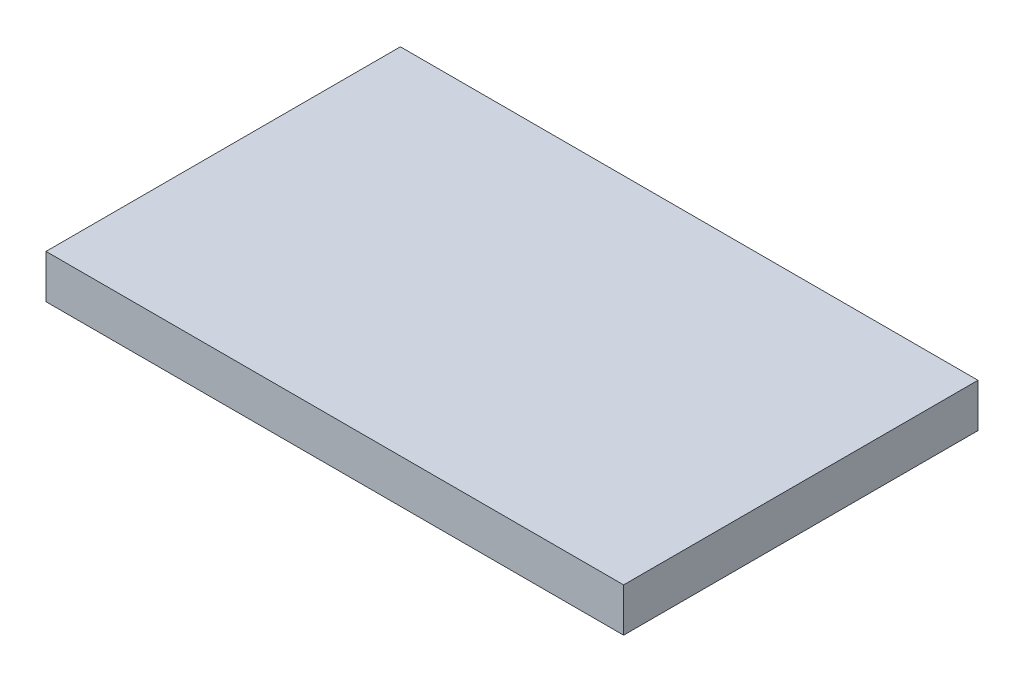
ISO-10303-21;
HEADER;
FILE_DESCRIPTION(('STEP AP214'),'2;1');
FILE_NAME('part.step','',(''),(''),'','','');
FILE_SCHEMA(('AUTOMOTIVE_DESIGN { 1 0 10303 214 1 1 1 1 }'));
ENDSEC;
DATA;
#1=APPLICATION_CONTEXT('core data for automotive mechanical design processes');
#2=APPLICATION_PROTOCOL_DEFINITION('international standard','automotive_design',2000,#1);
#3=PRODUCT_CONTEXT('',#1,'mechanical');
#4=PRODUCT('Part','Part','',(#3));
#5=PRODUCT_RELATED_PRODUCT_CATEGORY('part','',(#4));
#6=PRODUCT_DEFINITION_FORMATION('','',#4);
#7=PRODUCT_DEFINITION_CONTEXT('part definition',#1,'design');
#8=PRODUCT_DEFINITION('design','',#6,#7);
#9=PRODUCT_DEFINITION_SHAPE('','',#8);
#10=(LENGTH_UNIT() NAMED_UNIT(*) SI_UNIT(.MILLI.,.METRE.));
#11=(NAMED_UNIT(*) PLANE_ANGLE_UNIT() SI_UNIT($,.RADIAN.));
#12=(NAMED_UNIT(*) SI_UNIT($,.STERADIAN.) SOLID_ANGLE_UNIT());
#13=UNCERTAINTY_MEASURE_WITH_UNIT(LENGTH_MEASURE(1.E-05),#10,'distance_accuracy_value','');
#14=(GEOMETRIC_REPRESENTATION_CONTEXT(3) GLOBAL_UNCERTAINTY_ASSIGNED_CONTEXT((#13)) GLOBAL_UNIT_ASSIGNED_CONTEXT((#10,
#11,#12)) REPRESENTATION_CONTEXT('',''));
#15=CARTESIAN_POINT('',(0.,0.,0.));
#16=DIRECTION('',(0.,0.,1.));
#17=DIRECTION('',(1.,0.,0.));
#18=AXIS2_PLACEMENT_3D('',#15,#16,#17);
#19=CARTESIAN_POINT('',(0.,3.125,0.));
#20=DIRECTION('',(1.,0.,0.));
#21=DIRECTION('',(0.,0.,-1.));
#22=AXIS2_PLACEMENT_3D('',#19,#20,#21);
#23=PLANE('',#22);
#24=DIRECTION('',(0.,0.,1.));
#25=VECTOR('',#24,1.);
#26=CARTESIAN_POINT('',(0.,0.,0.));
#27=LINE('',#26,#25);
#28=CARTESIAN_POINT('',(0.,0.,-25.4));
#29=VERTEX_POINT('',#28);
#30=CARTESIAN_POINT('',(0.,0.,0.));
#31=VERTEX_POINT('',#30);
#32=EDGE_CURVE('E104',#29,#31,#27,.T.);
#33=ORIENTED_EDGE('',*,*,#32,.T.);
#34=DIRECTION('',(0.,-1.,0.));
#35=VECTOR('',#34,1.);
#36=CARTESIAN_POINT('',(0.,3.125,0.));
#37=LINE('',#36,#35);
#38=CARTESIAN_POINT('',(0.,3.125,0.));
#39=VERTEX_POINT('',#38);
#40=EDGE_CURVE('E11',#39,#31,#37,.T.);
#41=ORIENTED_EDGE('',*,*,#40,.F.);
#42=DIRECTION('',(0.,0.,1.));
#43=VECTOR('',#42,1.);
#44=CARTESIAN_POINT('',(0.,3.125,0.));
#45=LINE('',#44,#43);
#46=CARTESIAN_POINT('',(0.,3.125,-25.4));
#47=VERTEX_POINT('',#46);
#48=EDGE_CURVE('E92',#47,#39,#45,.T.);
#49=ORIENTED_EDGE('',*,*,#48,.F.);
#50=DIRECTION('',(0.,-1.,0.));
#51=VECTOR('',#50,1.);
#52=CARTESIAN_POINT('',(0.,3.125,-25.4));
#53=LINE('',#52,#51);
#54=EDGE_CURVE('E100',#47,#29,#53,.T.);
#55=ORIENTED_EDGE('',*,*,#54,.T.);
#56=EDGE_LOOP('',(#33,#41,#49,#55));
#57=FACE_BOUND('',#56,.T.);
#58=ADVANCED_FACE('F41',(#57),#23,.F.);
#59=CARTESIAN_POINT('',(0.,3.125,0.));
#60=DIRECTION('',(0.,0.,-1.));
#61=DIRECTION('',(-1.,0.,0.));
#62=AXIS2_PLACEMENT_3D('',#59,#60,#61);
#63=PLANE('',#62);
#64=DIRECTION('',(1.,0.,0.));
#65=VECTOR('',#64,1.);
#66=CARTESIAN_POINT('',(0.,0.,0.));
#67=LINE('',#66,#65);
#68=CARTESIAN_POINT('',(41.4,0.,0.));
#69=VERTEX_POINT('',#68);
#70=EDGE_CURVE('E96',#31,#69,#67,.T.);
#71=ORIENTED_EDGE('',*,*,#70,.T.);
#72=DIRECTION('',(0.,-1.,0.));
#73=VECTOR('',#72,1.);
#74=CARTESIAN_POINT('',(41.4,3.125,0.));
#75=LINE('',#74,#73);
#76=CARTESIAN_POINT('',(41.4,3.125,0.));
#77=VERTEX_POINT('',#76);
#78=EDGE_CURVE('E49',#77,#69,#75,.T.);
#79=ORIENTED_EDGE('',*,*,#78,.F.);
#80=DIRECTION('',(1.,0.,0.));
#81=VECTOR('',#80,1.);
#82=CARTESIAN_POINT('',(0.,3.125,0.));
#83=LINE('',#82,#81);
#84=EDGE_CURVE('E87',#39,#77,#83,.T.);
#85=ORIENTED_EDGE('',*,*,#84,.F.);
#86=ORIENTED_EDGE('',*,*,#40,.T.);
#87=EDGE_LOOP('',(#71,#79,#85,#86));
#88=FACE_BOUND('',#87,.T.);
#89=ADVANCED_FACE('F95',(#88),#63,.F.);
#90=CARTESIAN_POINT('',(41.4,3.125,0.));
#91=DIRECTION('',(-1.,0.,0.));
#92=DIRECTION('',(0.,0.,1.));
#93=AXIS2_PLACEMENT_3D('',#90,#91,#92);
#94=PLANE('',#93);
#95=DIRECTION('',(0.,0.,-1.));
#96=VECTOR('',#95,1.);
#97=CARTESIAN_POINT('',(41.4,0.,0.));
#98=LINE('',#97,#96);
#99=CARTESIAN_POINT('',(41.4,0.,-25.4));
#100=VERTEX_POINT('',#99);
#101=EDGE_CURVE('E74',#69,#100,#98,.T.);
#102=ORIENTED_EDGE('',*,*,#101,.T.);
#103=DIRECTION('',(0.,-1.,0.));
#104=VECTOR('',#103,1.);
#105=CARTESIAN_POINT('',(41.4,3.125,-25.4));
#106=LINE('',#105,#104);
#107=CARTESIAN_POINT('',(41.4,3.125,-25.4));
#108=VERTEX_POINT('',#107);
#109=EDGE_CURVE('E97',#108,#100,#106,.T.);
#110=ORIENTED_EDGE('',*,*,#109,.F.);
#111=DIRECTION('',(0.,0.,-1.));
#112=VECTOR('',#111,1.);
#113=CARTESIAN_POINT('',(41.4,3.125,0.));
#114=LINE('',#113,#112);
#115=EDGE_CURVE('E90',#77,#108,#114,.T.);
#116=ORIENTED_EDGE('',*,*,#115,.F.);
#117=ORIENTED_EDGE('',*,*,#78,.T.);
#118=EDGE_LOOP('',(#102,#110,#116,#117));
#119=FACE_BOUND('',#118,.T.);
#120=ADVANCED_FACE('F98',(#119),#94,.F.);
#121=CARTESIAN_POINT('',(0.,3.125,-25.4));
#122=DIRECTION('',(0.,0.,1.));
#123=DIRECTION('',(1.,0.,0.));
#124=AXIS2_PLACEMENT_3D('',#121,#122,#123);
#125=PLANE('',#124);
#126=DIRECTION('',(-1.,0.,0.));
#127=VECTOR('',#126,1.);
#128=CARTESIAN_POINT('',(0.,0.,-25.4));
#129=LINE('',#128,#127);
#130=EDGE_CURVE('E80',#100,#29,#129,.T.);
#131=ORIENTED_EDGE('',*,*,#130,.T.);
#132=ORIENTED_EDGE('',*,*,#54,.F.);
#133=DIRECTION('',(-1.,0.,0.));
#134=VECTOR('',#133,1.);
#135=CARTESIAN_POINT('',(0.,3.125,-25.4));
#136=LINE('',#135,#134);
#137=EDGE_CURVE('E57',#108,#47,#136,.T.);
#138=ORIENTED_EDGE('',*,*,#137,.F.);
#139=ORIENTED_EDGE('',*,*,#109,.T.);
#140=EDGE_LOOP('',(#131,#132,#138,#139));
#141=FACE_BOUND('',#140,.T.);
#142=ADVANCED_FACE('F111',(#141),#125,.F.);
#143=CARTESIAN_POINT('',(0.,3.125,0.));
#144=DIRECTION('',(0.,-1.,0.));
#145=DIRECTION('',(0.,0.,-1.));
#146=AXIS2_PLACEMENT_3D('',#143,#144,#145);
#147=PLANE('',#146);
#148=ORIENTED_EDGE('',*,*,#48,.T.);
#149=ORIENTED_EDGE('',*,*,#84,.T.);
#150=ORIENTED_EDGE('',*,*,#115,.T.);
#151=ORIENTED_EDGE('',*,*,#137,.T.);
#152=EDGE_LOOP('',(#148,#149,#150,#151));
#153=FACE_BOUND('',#152,.T.);
#154=ADVANCED_FACE('F88',(#153),#147,.F.);
#155=CARTESIAN_POINT('',(0.,0.,0.));
#156=DIRECTION('',(0.,-1.,0.));
#157=DIRECTION('',(0.,0.,-1.));
#158=AXIS2_PLACEMENT_3D('',#155,#156,#157);
#159=PLANE('',#158);
#160=ORIENTED_EDGE('',*,*,#32,.F.);
#161=ORIENTED_EDGE('',*,*,#130,.F.);
#162=ORIENTED_EDGE('',*,*,#101,.F.);
#163=ORIENTED_EDGE('',*,*,#70,.F.);
#164=EDGE_LOOP('',(#160,#161,#162,#163));
#165=FACE_BOUND('',#164,.T.);
#166=ADVANCED_FACE('F114',(#165),#159,.T.);
#167=CLOSED_SHELL('',(#58,#89,#120,#142,#154,#166));
#168=MANIFOLD_SOLID_BREP('B2',#167);
#169=ADVANCED_BREP_SHAPE_REPRESENTATION('',(#18,#168),#14);
#170=SHAPE_DEFINITION_REPRESENTATION(#9,#169);
ENDSEC;
END-ISO-10303-21;
